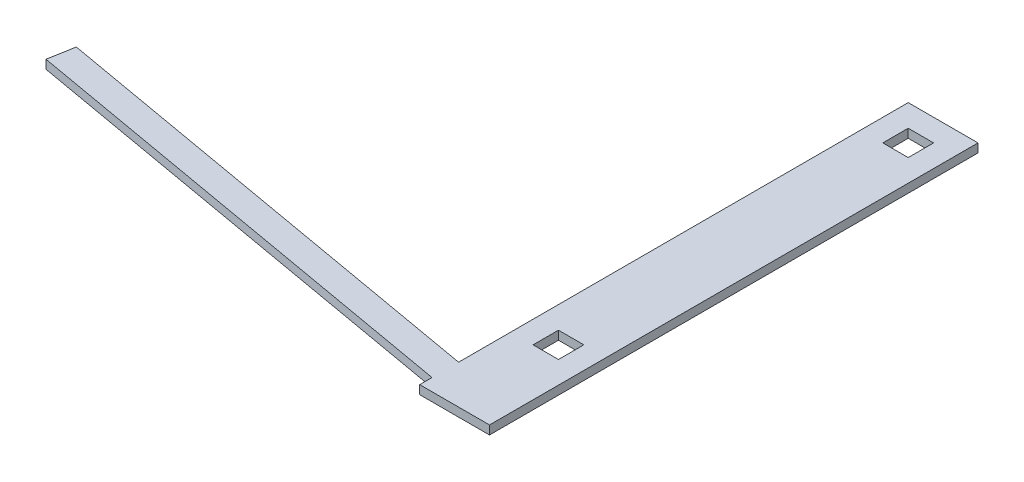
ISO-10303-21;
HEADER;
FILE_DESCRIPTION(('STEP AP214'),'2;1');
FILE_NAME('part.step','',(''),(''),'','','');
FILE_SCHEMA(('AUTOMOTIVE_DESIGN { 1 0 10303 214 1 1 1 1 }'));
ENDSEC;
DATA;
#1=APPLICATION_CONTEXT('core data for automotive mechanical design processes');
#2=APPLICATION_PROTOCOL_DEFINITION('international standard','automotive_design',2000,#1);
#3=PRODUCT_CONTEXT('',#1,'mechanical');
#4=PRODUCT('Part','Part','',(#3));
#5=PRODUCT_RELATED_PRODUCT_CATEGORY('part','',(#4));
#6=PRODUCT_DEFINITION_FORMATION('','',#4);
#7=PRODUCT_DEFINITION_CONTEXT('part definition',#1,'design');
#8=PRODUCT_DEFINITION('design','',#6,#7);
#9=PRODUCT_DEFINITION_SHAPE('','',#8);
#10=(LENGTH_UNIT() NAMED_UNIT(*) SI_UNIT(.MILLI.,.METRE.));
#11=(NAMED_UNIT(*) PLANE_ANGLE_UNIT() SI_UNIT($,.RADIAN.));
#12=(NAMED_UNIT(*) SI_UNIT($,.STERADIAN.) SOLID_ANGLE_UNIT());
#13=UNCERTAINTY_MEASURE_WITH_UNIT(LENGTH_MEASURE(1.E-05),#10,'distance_accuracy_value','');
#14=(GEOMETRIC_REPRESENTATION_CONTEXT(3) GLOBAL_UNCERTAINTY_ASSIGNED_CONTEXT((#13)) GLOBAL_UNIT_ASSIGNED_CONTEXT((#10,
#11,#12)) REPRESENTATION_CONTEXT('',''));
#15=CARTESIAN_POINT('',(0.,0.,0.));
#16=DIRECTION('',(0.,0.,1.));
#17=DIRECTION('',(1.,0.,0.));
#18=AXIS2_PLACEMENT_3D('',#15,#16,#17);
#19=CARTESIAN_POINT('',(0.00806420124320646,1.5875,-101.892781150368));
#20=DIRECTION('',(1.,0.,0.));
#21=DIRECTION('',(0.,0.,-1.));
#22=AXIS2_PLACEMENT_3D('',#19,#20,#21);
#23=PLANE('',#22);
#24=DIRECTION('',(0.,-1.,0.));
#25=VECTOR('',#24,1.);
#26=CARTESIAN_POINT('',(0.00806420124321646,89.1279556426417,-20.0681030444711));
#27=LINE('',#26,#25);
#28=CARTESIAN_POINT('',(0.00806420124321648,1.5875,-20.0681030444711));
#29=VERTEX_POINT('',#28);
#30=CARTESIAN_POINT('',(0.00806420124321646,0.,-20.0681030444711));
#31=VERTEX_POINT('',#30);
#32=EDGE_CURVE('E58',#29,#31,#27,.T.);
#33=ORIENTED_EDGE('',*,*,#32,.F.);
#34=DIRECTION('',(0.,0.,1.));
#35=VECTOR('',#34,1.);
#36=CARTESIAN_POINT('',(0.00806420124320646,1.5875,-101.892781150368));
#37=LINE('',#36,#35);
#38=CARTESIAN_POINT('',(0.00806420124320646,1.5875,-101.892781150368));
#39=VERTEX_POINT('',#38);
#40=EDGE_CURVE('E251',#39,#29,#37,.T.);
#41=ORIENTED_EDGE('',*,*,#40,.F.);
#42=DIRECTION('',(0.,-1.,0.));
#43=VECTOR('',#42,1.);
#44=CARTESIAN_POINT('',(0.00806420124320646,1.5875,-101.892781150368));
#45=LINE('',#44,#43);
#46=CARTESIAN_POINT('',(0.00806420124320646,0.,-101.892781150368));
#47=VERTEX_POINT('',#46);
#48=EDGE_CURVE('E259',#39,#47,#45,.T.);
#49=ORIENTED_EDGE('',*,*,#48,.T.);
#50=DIRECTION('',(0.,0.,1.));
#51=VECTOR('',#50,1.);
#52=CARTESIAN_POINT('',(0.00806420124320646,0.,-101.892781150368));
#53=LINE('',#52,#51);
#54=EDGE_CURVE('E260',#47,#31,#53,.T.);
#55=ORIENTED_EDGE('',*,*,#54,.T.);
#56=EDGE_LOOP('',(#33,#41,#49,#55));
#57=FACE_BOUND('',#56,.T.);
#58=ADVANCED_FACE('F35',(#57),#23,.F.);
#59=CARTESIAN_POINT('',(0.,1.5875,0.));
#60=DIRECTION('',(0.,1.,0.));
#61=DIRECTION('',(0.,0.,1.));
#62=AXIS2_PLACEMENT_3D('',#59,#60,#61);
#63=PLANE('',#62);
#64=ORIENTED_EDGE('',*,*,#40,.T.);
#65=DIRECTION('',(0.984807753012209,0.,0.173648177666927));
#66=VECTOR('',#65,1.);
#67=CARTESIAN_POINT('',(3.4320909051933,1.58750000000001,-19.4643547538984));
#68=LINE('',#67,#66);
#69=CARTESIAN_POINT('',(-84.4533077773328,1.58750000000001,-34.9609217519477));
#70=VERTEX_POINT('',#69);
#71=EDGE_CURVE('E177',#70,#29,#68,.T.);
#72=ORIENTED_EDGE('',*,*,#71,.F.);
#73=DIRECTION('',(0.173648177666928,0.,-0.984807753012209));
#74=VECTOR('',#73,1.);
#75=CARTESIAN_POINT('',(-87.8853986825261,1.58750000000001,-15.4965669980493));
#76=LINE('',#75,#74);
#77=CARTESIAN_POINT('',(-85.2803072234715,1.58750000000001,-30.270774828227));
#78=VERTEX_POINT('',#77);
#79=EDGE_CURVE('E159',#78,#70,#76,.T.);
#80=ORIENTED_EDGE('',*,*,#79,.F.);
#81=DIRECTION('',(-0.984807753012209,0.,-0.173648177666928));
#82=VECTOR('',#81,1.);
#83=CARTESIAN_POINT('',(2.60509145905456,1.58750000000001,-14.7742078301777));
#84=LINE('',#83,#82);
#85=CARTESIAN_POINT('',(0.00806420124321707,1.5875,-15.2321338053652));
#86=VERTEX_POINT('',#85);
#87=EDGE_CURVE('E156',#86,#78,#84,.T.);
#88=ORIENTED_EDGE('',*,*,#87,.F.);
#89=CARTESIAN_POINT('',(0.00806420124321735,1.5875,-12.9927811503677));
#90=VERTEX_POINT('',#89);
#91=EDGE_CURVE('E50',#86,#90,#37,.T.);
#92=ORIENTED_EDGE('',*,*,#91,.T.);
#93=DIRECTION('',(1.,0.,0.));
#94=VECTOR('',#93,1.);
#95=CARTESIAN_POINT('',(0.00806420124321735,1.5875,-12.9927811503677));
#96=LINE('',#95,#94);
#97=CARTESIAN_POINT('',(12.7080642012432,1.5875,-12.9927811503677));
#98=VERTEX_POINT('',#97);
#99=EDGE_CURVE('E253',#90,#98,#96,.T.);
#100=ORIENTED_EDGE('',*,*,#99,.T.);
#101=DIRECTION('',(0.,0.,-1.));
#102=VECTOR('',#101,1.);
#103=CARTESIAN_POINT('',(12.7080642012432,1.5875,-101.892781150368));
#104=LINE('',#103,#102);
#105=CARTESIAN_POINT('',(12.7080642012432,1.5875,-101.892781150368));
#106=VERTEX_POINT('',#105);
#107=EDGE_CURVE('E255',#98,#106,#104,.T.);
#108=ORIENTED_EDGE('',*,*,#107,.T.);
#109=DIRECTION('',(-1.,0.,0.));
#110=VECTOR('',#109,1.);
#111=CARTESIAN_POINT('',(0.00806420124320646,1.5875,-101.892781150368));
#112=LINE('',#111,#110);
#113=EDGE_CURVE('E257',#106,#39,#112,.T.);
#114=ORIENTED_EDGE('',*,*,#113,.T.);
#115=EDGE_LOOP('',(#64,#72,#80,#88,#92,#100,#108,#114));
#116=FACE_BOUND('',#115,.T.);
#117=DIRECTION('',(1.,0.,0.));
#118=VECTOR('',#117,1.);
#119=CARTESIAN_POINT('',(4.04806420124321,1.5875,-93.2327811503677));
#120=LINE('',#119,#118);
#121=CARTESIAN_POINT('',(4.04806420124321,1.5875,-93.2327811503677));
#122=VERTEX_POINT('',#121);
#123=CARTESIAN_POINT('',(8.66806420124321,1.5875,-93.2327811503677));
#124=VERTEX_POINT('',#123);
#125=EDGE_CURVE('E223',#122,#124,#120,.T.);
#126=ORIENTED_EDGE('',*,*,#125,.F.);
#127=DIRECTION('',(0.,0.,1.));
#128=VECTOR('',#127,1.);
#129=CARTESIAN_POINT('',(4.04806420124321,1.5875,-97.8527811503677));
#130=LINE('',#129,#128);
#131=CARTESIAN_POINT('',(4.04806420124321,1.5875,-97.8527811503677));
#132=VERTEX_POINT('',#131);
#133=EDGE_CURVE('E221',#132,#122,#130,.T.);
#134=ORIENTED_EDGE('',*,*,#133,.F.);
#135=DIRECTION('',(-1.,0.,0.));
#136=VECTOR('',#135,1.);
#137=CARTESIAN_POINT('',(4.04806420124321,1.5875,-97.8527811503677));
#138=LINE('',#137,#136);
#139=CARTESIAN_POINT('',(8.66806420124321,1.5875,-97.8527811503677));
#140=VERTEX_POINT('',#139);
#141=EDGE_CURVE('E229',#140,#132,#138,.T.);
#142=ORIENTED_EDGE('',*,*,#141,.F.);
#143=DIRECTION('',(0.,0.,-1.));
#144=VECTOR('',#143,1.);
#145=CARTESIAN_POINT('',(8.66806420124321,1.5875,-97.8527811503677));
#146=LINE('',#145,#144);
#147=EDGE_CURVE('E226',#124,#140,#146,.T.);
#148=ORIENTED_EDGE('',*,*,#147,.F.);
#149=EDGE_LOOP('',(#126,#134,#142,#148));
#150=FACE_BOUND('',#149,.T.);
#151=DIRECTION('',(0.,0.,1.));
#152=VECTOR('',#151,1.);
#153=CARTESIAN_POINT('',(4.04806420124387,1.5875,-34.2027811503677));
#154=LINE('',#153,#152);
#155=CARTESIAN_POINT('',(4.04806420124387,1.5875,-34.2027811503677));
#156=VERTEX_POINT('',#155);
#157=CARTESIAN_POINT('',(4.04806420124387,1.5875,-29.5827811503677));
#158=VERTEX_POINT('',#157);
#159=EDGE_CURVE('E192',#156,#158,#154,.T.);
#160=ORIENTED_EDGE('',*,*,#159,.F.);
#161=DIRECTION('',(-1.,0.,0.));
#162=VECTOR('',#161,1.);
#163=CARTESIAN_POINT('',(4.04806420124387,1.5875,-34.2027811503677));
#164=LINE('',#163,#162);
#165=CARTESIAN_POINT('',(8.66806420124387,1.5875,-34.2027811503677));
#166=VERTEX_POINT('',#165);
#167=EDGE_CURVE('E190',#166,#156,#164,.T.);
#168=ORIENTED_EDGE('',*,*,#167,.F.);
#169=DIRECTION('',(0.,0.,-1.));
#170=VECTOR('',#169,1.);
#171=CARTESIAN_POINT('',(8.66806420124387,1.5875,-34.2027811503677));
#172=LINE('',#171,#170);
#173=CARTESIAN_POINT('',(8.66806420124387,1.5875,-29.5827811503677));
#174=VERTEX_POINT('',#173);
#175=EDGE_CURVE('E198',#174,#166,#172,.T.);
#176=ORIENTED_EDGE('',*,*,#175,.F.);
#177=DIRECTION('',(1.,0.,0.));
#178=VECTOR('',#177,1.);
#179=CARTESIAN_POINT('',(4.04806420124387,1.5875,-29.5827811503677));
#180=LINE('',#179,#178);
#181=EDGE_CURVE('E195',#158,#174,#180,.T.);
#182=ORIENTED_EDGE('',*,*,#181,.F.);
#183=EDGE_LOOP('',(#160,#168,#176,#182));
#184=FACE_BOUND('',#183,.T.);
#185=ADVANCED_FACE('F287',(#116,#150,#184),#63,.T.);
#186=CARTESIAN_POINT('',(0.,0.,0.));
#187=DIRECTION('',(0.,1.,0.));
#188=DIRECTION('',(0.,0.,1.));
#189=AXIS2_PLACEMENT_3D('',#186,#187,#188);
#190=PLANE('',#189);
#191=DIRECTION('',(0.,0.,1.));
#192=VECTOR('',#191,1.);
#193=CARTESIAN_POINT('',(4.04806420124321,0.,-97.8527811503677));
#194=LINE('',#193,#192);
#195=CARTESIAN_POINT('',(4.04806420124321,0.,-97.8527811503677));
#196=VERTEX_POINT('',#195);
#197=CARTESIAN_POINT('',(4.04806420124321,0.,-93.2327811503677));
#198=VERTEX_POINT('',#197);
#199=EDGE_CURVE('E220',#196,#198,#194,.T.);
#200=ORIENTED_EDGE('',*,*,#199,.T.);
#201=DIRECTION('',(1.,0.,0.));
#202=VECTOR('',#201,1.);
#203=CARTESIAN_POINT('',(4.04806420124321,0.,-93.2327811503677));
#204=LINE('',#203,#202);
#205=CARTESIAN_POINT('',(8.66806420124321,0.,-93.2327811503677));
#206=VERTEX_POINT('',#205);
#207=EDGE_CURVE('E234',#198,#206,#204,.T.);
#208=ORIENTED_EDGE('',*,*,#207,.T.);
#209=DIRECTION('',(0.,0.,-1.));
#210=VECTOR('',#209,1.);
#211=CARTESIAN_POINT('',(8.66806420124321,0.,-97.8527811503677));
#212=LINE('',#211,#210);
#213=CARTESIAN_POINT('',(8.66806420124321,0.,-97.8527811503677));
#214=VERTEX_POINT('',#213);
#215=EDGE_CURVE('E237',#206,#214,#212,.T.);
#216=ORIENTED_EDGE('',*,*,#215,.T.);
#217=DIRECTION('',(-1.,0.,0.));
#218=VECTOR('',#217,1.);
#219=CARTESIAN_POINT('',(4.04806420124321,0.,-97.8527811503677));
#220=LINE('',#219,#218);
#221=EDGE_CURVE('E224',#214,#196,#220,.T.);
#222=ORIENTED_EDGE('',*,*,#221,.T.);
#223=EDGE_LOOP('',(#200,#208,#216,#222));
#224=FACE_BOUND('',#223,.T.);
#225=ORIENTED_EDGE('',*,*,#54,.F.);
#226=DIRECTION('',(-1.,0.,0.));
#227=VECTOR('',#226,1.);
#228=CARTESIAN_POINT('',(0.00806420124320646,0.,-101.892781150368));
#229=LINE('',#228,#227);
#230=CARTESIAN_POINT('',(12.7080642012432,0.,-101.892781150368));
#231=VERTEX_POINT('',#230);
#232=EDGE_CURVE('E266',#231,#47,#229,.T.);
#233=ORIENTED_EDGE('',*,*,#232,.F.);
#234=DIRECTION('',(0.,0.,-1.));
#235=VECTOR('',#234,1.);
#236=CARTESIAN_POINT('',(12.7080642012432,0.,-101.892781150368));
#237=LINE('',#236,#235);
#238=CARTESIAN_POINT('',(12.7080642012432,0.,-12.9927811503677));
#239=VERTEX_POINT('',#238);
#240=EDGE_CURVE('E264',#239,#231,#237,.T.);
#241=ORIENTED_EDGE('',*,*,#240,.F.);
#242=DIRECTION('',(1.,0.,0.));
#243=VECTOR('',#242,1.);
#244=CARTESIAN_POINT('',(0.00806420124321735,0.,-12.9927811503677));
#245=LINE('',#244,#243);
#246=CARTESIAN_POINT('',(0.00806420124321735,0.,-12.9927811503677));
#247=VERTEX_POINT('',#246);
#248=EDGE_CURVE('E262',#247,#239,#245,.T.);
#249=ORIENTED_EDGE('',*,*,#248,.F.);
#250=CARTESIAN_POINT('',(0.00806420124321707,0.,-15.2321338053652));
#251=VERTEX_POINT('',#250);
#252=EDGE_CURVE('E176',#251,#247,#53,.T.);
#253=ORIENTED_EDGE('',*,*,#252,.F.);
#254=DIRECTION('',(-0.984807753012209,0.,-0.173648177666928));
#255=VECTOR('',#254,1.);
#256=CARTESIAN_POINT('',(2.60509145905456,0.,-14.7742078301777));
#257=LINE('',#256,#255);
#258=CARTESIAN_POINT('',(-85.2803072234715,0.,-30.270774828227));
#259=VERTEX_POINT('',#258);
#260=EDGE_CURVE('E155',#251,#259,#257,.T.);
#261=ORIENTED_EDGE('',*,*,#260,.T.);
#262=DIRECTION('',(0.173648177666928,0.,-0.984807753012208));
#263=VECTOR('',#262,1.);
#264=CARTESIAN_POINT('',(-87.8853986825261,0.,-15.4965669980493));
#265=LINE('',#264,#263);
#266=CARTESIAN_POINT('',(-84.4533077773328,0.,-34.9609217519477));
#267=VERTEX_POINT('',#266);
#268=EDGE_CURVE('E162',#259,#267,#265,.T.);
#269=ORIENTED_EDGE('',*,*,#268,.T.);
#270=DIRECTION('',(0.984807753012209,0.,0.173648177666927));
#271=VECTOR('',#270,1.);
#272=CARTESIAN_POINT('',(3.4320909051933,0.,-19.4643547538984));
#273=LINE('',#272,#271);
#274=EDGE_CURVE('E169',#267,#31,#273,.T.);
#275=ORIENTED_EDGE('',*,*,#274,.T.);
#276=EDGE_LOOP('',(#225,#233,#241,#249,#253,#261,#269,#275));
#277=FACE_BOUND('',#276,.T.);
#278=DIRECTION('',(-1.,0.,0.));
#279=VECTOR('',#278,1.);
#280=CARTESIAN_POINT('',(4.04806420124387,0.,-34.2027811503677));
#281=LINE('',#280,#279);
#282=CARTESIAN_POINT('',(8.66806420124387,0.,-34.2027811503677));
#283=VERTEX_POINT('',#282);
#284=CARTESIAN_POINT('',(4.04806420124387,0.,-34.2027811503677));
#285=VERTEX_POINT('',#284);
#286=EDGE_CURVE('E189',#283,#285,#281,.T.);
#287=ORIENTED_EDGE('',*,*,#286,.T.);
#288=DIRECTION('',(0.,0.,1.));
#289=VECTOR('',#288,1.);
#290=CARTESIAN_POINT('',(4.04806420124387,0.,-34.2027811503677));
#291=LINE('',#290,#289);
#292=CARTESIAN_POINT('',(4.04806420124387,0.,-29.5827811503677));
#293=VERTEX_POINT('',#292);
#294=EDGE_CURVE('E203',#285,#293,#291,.T.);
#295=ORIENTED_EDGE('',*,*,#294,.T.);
#296=DIRECTION('',(1.,0.,0.));
#297=VECTOR('',#296,1.);
#298=CARTESIAN_POINT('',(4.04806420124387,0.,-29.5827811503677));
#299=LINE('',#298,#297);
#300=CARTESIAN_POINT('',(8.66806420124387,0.,-29.5827811503677));
#301=VERTEX_POINT('',#300);
#302=EDGE_CURVE('E206',#293,#301,#299,.T.);
#303=ORIENTED_EDGE('',*,*,#302,.T.);
#304=DIRECTION('',(0.,0.,-1.));
#305=VECTOR('',#304,1.);
#306=CARTESIAN_POINT('',(8.66806420124387,0.,-34.2027811503677));
#307=LINE('',#306,#305);
#308=EDGE_CURVE('E193',#301,#283,#307,.T.);
#309=ORIENTED_EDGE('',*,*,#308,.T.);
#310=EDGE_LOOP('',(#287,#295,#303,#309));
#311=FACE_BOUND('',#310,.T.);
#312=ADVANCED_FACE('F173',(#224,#277,#311),#190,.F.);
#313=ORIENTED_EDGE('',*,*,#91,.F.);
#314=DIRECTION('',(0.,-1.,0.));
#315=VECTOR('',#314,1.);
#316=CARTESIAN_POINT('',(0.00806420124321697,89.1279556426417,-15.2321338053652));
#317=LINE('',#316,#315);
#318=EDGE_CURVE('E184',#86,#251,#317,.T.);
#319=ORIENTED_EDGE('',*,*,#318,.T.);
#320=ORIENTED_EDGE('',*,*,#252,.T.);
#321=DIRECTION('',(0.,-1.,0.));
#322=VECTOR('',#321,1.);
#323=CARTESIAN_POINT('',(0.00806420124321735,1.5875,-12.9927811503677));
#324=LINE('',#323,#322);
#325=EDGE_CURVE('E11',#90,#247,#324,.T.);
#326=ORIENTED_EDGE('',*,*,#325,.F.);
#327=EDGE_LOOP('',(#313,#319,#320,#326));
#328=FACE_BOUND('',#327,.T.);
#329=ADVANCED_FACE('F37',(#328),#23,.F.);
#330=CARTESIAN_POINT('',(0.00806420124321735,1.5875,-12.9927811503677));
#331=DIRECTION('',(0.,0.,-1.));
#332=DIRECTION('',(-1.,0.,0.));
#333=AXIS2_PLACEMENT_3D('',#330,#331,#332);
#334=PLANE('',#333);
#335=ORIENTED_EDGE('',*,*,#248,.T.);
#336=DIRECTION('',(0.,-1.,0.));
#337=VECTOR('',#336,1.);
#338=CARTESIAN_POINT('',(12.7080642012432,1.5875,-12.9927811503677));
#339=LINE('',#338,#337);
#340=EDGE_CURVE('E43',#98,#239,#339,.T.);
#341=ORIENTED_EDGE('',*,*,#340,.F.);
#342=ORIENTED_EDGE('',*,*,#99,.F.);
#343=ORIENTED_EDGE('',*,*,#325,.T.);
#344=EDGE_LOOP('',(#335,#341,#342,#343));
#345=FACE_BOUND('',#344,.T.);
#346=ADVANCED_FACE('F308',(#345),#334,.F.);
#347=CARTESIAN_POINT('',(12.7080642012432,1.5875,-101.892781150368));
#348=DIRECTION('',(-1.,0.,0.));
#349=DIRECTION('',(0.,0.,1.));
#350=AXIS2_PLACEMENT_3D('',#347,#348,#349);
#351=PLANE('',#350);
#352=ORIENTED_EDGE('',*,*,#240,.T.);
#353=DIRECTION('',(0.,-1.,0.));
#354=VECTOR('',#353,1.);
#355=CARTESIAN_POINT('',(12.7080642012432,1.5875,-101.892781150368));
#356=LINE('',#355,#354);
#357=EDGE_CURVE('E270',#106,#231,#356,.T.);
#358=ORIENTED_EDGE('',*,*,#357,.F.);
#359=ORIENTED_EDGE('',*,*,#107,.F.);
#360=ORIENTED_EDGE('',*,*,#340,.T.);
#361=EDGE_LOOP('',(#352,#358,#359,#360));
#362=FACE_BOUND('',#361,.T.);
#363=ADVANCED_FACE('F277',(#362),#351,.F.);
#364=CARTESIAN_POINT('',(0.00806420124320646,1.5875,-101.892781150368));
#365=DIRECTION('',(0.,0.,1.));
#366=DIRECTION('',(1.,0.,0.));
#367=AXIS2_PLACEMENT_3D('',#364,#365,#366);
#368=PLANE('',#367);
#369=ORIENTED_EDGE('',*,*,#232,.T.);
#370=ORIENTED_EDGE('',*,*,#48,.F.);
#371=ORIENTED_EDGE('',*,*,#113,.F.);
#372=ORIENTED_EDGE('',*,*,#357,.T.);
#373=EDGE_LOOP('',(#369,#370,#371,#372));
#374=FACE_BOUND('',#373,.T.);
#375=ADVANCED_FACE('F284',(#374),#368,.F.);
#376=CARTESIAN_POINT('',(4.04806420124321,1.5875,-97.8527811503677));
#377=DIRECTION('',(1.,0.,0.));
#378=DIRECTION('',(0.,0.,-1.));
#379=AXIS2_PLACEMENT_3D('',#376,#377,#378);
#380=PLANE('',#379);
#381=ORIENTED_EDGE('',*,*,#199,.F.);
#382=DIRECTION('',(0.,-1.,0.));
#383=VECTOR('',#382,1.);
#384=CARTESIAN_POINT('',(4.04806420124321,1.5875,-97.8527811503677));
#385=LINE('',#384,#383);
#386=EDGE_CURVE('E231',#132,#196,#385,.T.);
#387=ORIENTED_EDGE('',*,*,#386,.F.);
#388=ORIENTED_EDGE('',*,*,#133,.T.);
#389=DIRECTION('',(0.,-1.,0.));
#390=VECTOR('',#389,1.);
#391=CARTESIAN_POINT('',(4.04806420124321,1.5875,-93.2327811503677));
#392=LINE('',#391,#390);
#393=EDGE_CURVE('E248',#122,#198,#392,.T.);
#394=ORIENTED_EDGE('',*,*,#393,.T.);
#395=EDGE_LOOP('',(#381,#387,#388,#394));
#396=FACE_BOUND('',#395,.T.);
#397=ADVANCED_FACE('F321',(#396),#380,.T.);
#398=CARTESIAN_POINT('',(4.04806420124321,1.5875,-93.2327811503677));
#399=DIRECTION('',(0.,0.,-1.));
#400=DIRECTION('',(-1.,0.,0.));
#401=AXIS2_PLACEMENT_3D('',#398,#399,#400);
#402=PLANE('',#401);
#403=ORIENTED_EDGE('',*,*,#207,.F.);
#404=ORIENTED_EDGE('',*,*,#393,.F.);
#405=ORIENTED_EDGE('',*,*,#125,.T.);
#406=DIRECTION('',(0.,-1.,0.));
#407=VECTOR('',#406,1.);
#408=CARTESIAN_POINT('',(8.66806420124321,1.5875,-93.2327811503677));
#409=LINE('',#408,#407);
#410=EDGE_CURVE('E246',#124,#206,#409,.T.);
#411=ORIENTED_EDGE('',*,*,#410,.T.);
#412=EDGE_LOOP('',(#403,#404,#405,#411));
#413=FACE_BOUND('',#412,.T.);
#414=ADVANCED_FACE('F337',(#413),#402,.T.);
#415=CARTESIAN_POINT('',(8.66806420124321,1.5875,-97.8527811503677));
#416=DIRECTION('',(-1.,0.,0.));
#417=DIRECTION('',(0.,0.,1.));
#418=AXIS2_PLACEMENT_3D('',#415,#416,#417);
#419=PLANE('',#418);
#420=ORIENTED_EDGE('',*,*,#215,.F.);
#421=ORIENTED_EDGE('',*,*,#410,.F.);
#422=ORIENTED_EDGE('',*,*,#147,.T.);
#423=DIRECTION('',(0.,-1.,0.));
#424=VECTOR('',#423,1.);
#425=CARTESIAN_POINT('',(8.66806420124321,1.5875,-97.8527811503677));
#426=LINE('',#425,#424);
#427=EDGE_CURVE('E244',#140,#214,#426,.T.);
#428=ORIENTED_EDGE('',*,*,#427,.T.);
#429=EDGE_LOOP('',(#420,#421,#422,#428));
#430=FACE_BOUND('',#429,.T.);
#431=ADVANCED_FACE('F344',(#430),#419,.T.);
#432=CARTESIAN_POINT('',(4.04806420124321,1.5875,-97.8527811503677));
#433=DIRECTION('',(0.,0.,1.));
#434=DIRECTION('',(1.,0.,0.));
#435=AXIS2_PLACEMENT_3D('',#432,#433,#434);
#436=PLANE('',#435);
#437=ORIENTED_EDGE('',*,*,#221,.F.);
#438=ORIENTED_EDGE('',*,*,#427,.F.);
#439=ORIENTED_EDGE('',*,*,#141,.T.);
#440=ORIENTED_EDGE('',*,*,#386,.T.);
#441=EDGE_LOOP('',(#437,#438,#439,#440));
#442=FACE_BOUND('',#441,.T.);
#443=ADVANCED_FACE('F352',(#442),#436,.T.);
#444=CARTESIAN_POINT('',(4.04806420124387,1.5875,-34.2027811503677));
#445=DIRECTION('',(0.,0.,1.));
#446=DIRECTION('',(1.,0.,0.));
#447=AXIS2_PLACEMENT_3D('',#444,#445,#446);
#448=PLANE('',#447);
#449=ORIENTED_EDGE('',*,*,#286,.F.);
#450=DIRECTION('',(0.,-1.,0.));
#451=VECTOR('',#450,1.);
#452=CARTESIAN_POINT('',(8.66806420124387,1.5875,-34.2027811503677));
#453=LINE('',#452,#451);
#454=EDGE_CURVE('E200',#166,#283,#453,.T.);
#455=ORIENTED_EDGE('',*,*,#454,.F.);
#456=ORIENTED_EDGE('',*,*,#167,.T.);
#457=DIRECTION('',(0.,-1.,0.));
#458=VECTOR('',#457,1.);
#459=CARTESIAN_POINT('',(4.04806420124387,1.5875,-34.2027811503677));
#460=LINE('',#459,#458);
#461=EDGE_CURVE('E217',#156,#285,#460,.T.);
#462=ORIENTED_EDGE('',*,*,#461,.T.);
#463=EDGE_LOOP('',(#449,#455,#456,#462));
#464=FACE_BOUND('',#463,.T.);
#465=ADVANCED_FACE('F360',(#464),#448,.T.);
#466=CARTESIAN_POINT('',(4.04806420124387,1.5875,-34.2027811503677));
#467=DIRECTION('',(1.,0.,0.));
#468=DIRECTION('',(0.,0.,-1.));
#469=AXIS2_PLACEMENT_3D('',#466,#467,#468);
#470=PLANE('',#469);
#471=ORIENTED_EDGE('',*,*,#294,.F.);
#472=ORIENTED_EDGE('',*,*,#461,.F.);
#473=ORIENTED_EDGE('',*,*,#159,.T.);
#474=DIRECTION('',(0.,-1.,0.));
#475=VECTOR('',#474,1.);
#476=CARTESIAN_POINT('',(4.04806420124387,1.5875,-29.5827811503677));
#477=LINE('',#476,#475);
#478=EDGE_CURVE('E215',#158,#293,#477,.T.);
#479=ORIENTED_EDGE('',*,*,#478,.T.);
#480=EDGE_LOOP('',(#471,#472,#473,#479));
#481=FACE_BOUND('',#480,.T.);
#482=ADVANCED_FACE('F368',(#481),#470,.T.);
#483=CARTESIAN_POINT('',(4.04806420124387,1.5875,-29.5827811503677));
#484=DIRECTION('',(0.,0.,-1.));
#485=DIRECTION('',(-1.,0.,0.));
#486=AXIS2_PLACEMENT_3D('',#483,#484,#485);
#487=PLANE('',#486);
#488=ORIENTED_EDGE('',*,*,#302,.F.);
#489=ORIENTED_EDGE('',*,*,#478,.F.);
#490=ORIENTED_EDGE('',*,*,#181,.T.);
#491=DIRECTION('',(0.,-1.,0.));
#492=VECTOR('',#491,1.);
#493=CARTESIAN_POINT('',(8.66806420124387,1.5875,-29.5827811503677));
#494=LINE('',#493,#492);
#495=EDGE_CURVE('E213',#174,#301,#494,.T.);
#496=ORIENTED_EDGE('',*,*,#495,.T.);
#497=EDGE_LOOP('',(#488,#489,#490,#496));
#498=FACE_BOUND('',#497,.T.);
#499=ADVANCED_FACE('F299',(#498),#487,.T.);
#500=CARTESIAN_POINT('',(8.66806420124387,1.5875,-34.2027811503677));
#501=DIRECTION('',(-1.,0.,0.));
#502=DIRECTION('',(0.,0.,1.));
#503=AXIS2_PLACEMENT_3D('',#500,#501,#502);
#504=PLANE('',#503);
#505=ORIENTED_EDGE('',*,*,#308,.F.);
#506=ORIENTED_EDGE('',*,*,#495,.F.);
#507=ORIENTED_EDGE('',*,*,#175,.T.);
#508=ORIENTED_EDGE('',*,*,#454,.T.);
#509=EDGE_LOOP('',(#505,#506,#507,#508));
#510=FACE_BOUND('',#509,.T.);
#511=ADVANCED_FACE('F292',(#510),#504,.T.);
#512=CARTESIAN_POINT('',(3.4320909051933,89.1279556426417,-19.4643547538984));
#513=DIRECTION('',(0.173648177666927,0.,-0.984807753012209));
#514=DIRECTION('',(-0.984807753012209,0.,-0.173648177666927));
#515=AXIS2_PLACEMENT_3D('',#512,#513,#514);
#516=PLANE('',#515);
#517=DIRECTION('',(0.,-1.,0.));
#518=VECTOR('',#517,1.);
#519=CARTESIAN_POINT('',(-84.4533077773328,89.1279556426417,-34.9609217519477));
#520=LINE('',#519,#518);
#521=EDGE_CURVE('E165',#70,#267,#520,.T.);
#522=ORIENTED_EDGE('',*,*,#521,.F.);
#523=ORIENTED_EDGE('',*,*,#71,.T.);
#524=ORIENTED_EDGE('',*,*,#32,.T.);
#525=ORIENTED_EDGE('',*,*,#274,.F.);
#526=EDGE_LOOP('',(#522,#523,#524,#525));
#527=FACE_BOUND('',#526,.T.);
#528=ADVANCED_FACE('F290',(#527),#516,.T.);
#529=CARTESIAN_POINT('',(2.60509145905456,89.1279556426417,-14.7742078301777));
#530=DIRECTION('',(-0.173648177666928,0.,0.984807753012209));
#531=DIRECTION('',(0.984807753012209,0.,0.173648177666928));
#532=AXIS2_PLACEMENT_3D('',#529,#530,#531);
#533=PLANE('',#532);
#534=ORIENTED_EDGE('',*,*,#318,.F.);
#535=ORIENTED_EDGE('',*,*,#87,.T.);
#536=DIRECTION('',(0.,-1.,0.));
#537=VECTOR('',#536,1.);
#538=CARTESIAN_POINT('',(-85.2803072234715,89.1279556426417,-30.270774828227));
#539=LINE('',#538,#537);
#540=EDGE_CURVE('E150',#78,#259,#539,.T.);
#541=ORIENTED_EDGE('',*,*,#540,.T.);
#542=ORIENTED_EDGE('',*,*,#260,.F.);
#543=EDGE_LOOP('',(#534,#535,#541,#542));
#544=FACE_BOUND('',#543,.T.);
#545=ADVANCED_FACE('F153',(#544),#533,.T.);
#546=CARTESIAN_POINT('',(-87.8853986825261,89.1279556426417,-15.4965669980493));
#547=DIRECTION('',(-0.984807753012208,0.,-0.173648177666928));
#548=DIRECTION('',(-0.173648177666928,0.,0.984807753012209));
#549=AXIS2_PLACEMENT_3D('',#546,#547,#548);
#550=PLANE('',#549);
#551=ORIENTED_EDGE('',*,*,#540,.F.);
#552=ORIENTED_EDGE('',*,*,#79,.T.);
#553=ORIENTED_EDGE('',*,*,#521,.T.);
#554=ORIENTED_EDGE('',*,*,#268,.F.);
#555=EDGE_LOOP('',(#551,#552,#553,#554));
#556=FACE_BOUND('',#555,.T.);
#557=ADVANCED_FACE('F163',(#556),#550,.T.);
#558=CLOSED_SHELL('',(#58,#185,#312,#329,#346,#363,#375,#397,#414,#431,#443,#465,#482,#499,#511,
#528,#545,#557));
#559=MANIFOLD_SOLID_BREP('B2',#558);
#560=ADVANCED_BREP_SHAPE_REPRESENTATION('',(#18,#559),#14);
#561=SHAPE_DEFINITION_REPRESENTATION(#9,#560);
ENDSEC;
END-ISO-10303-21;
